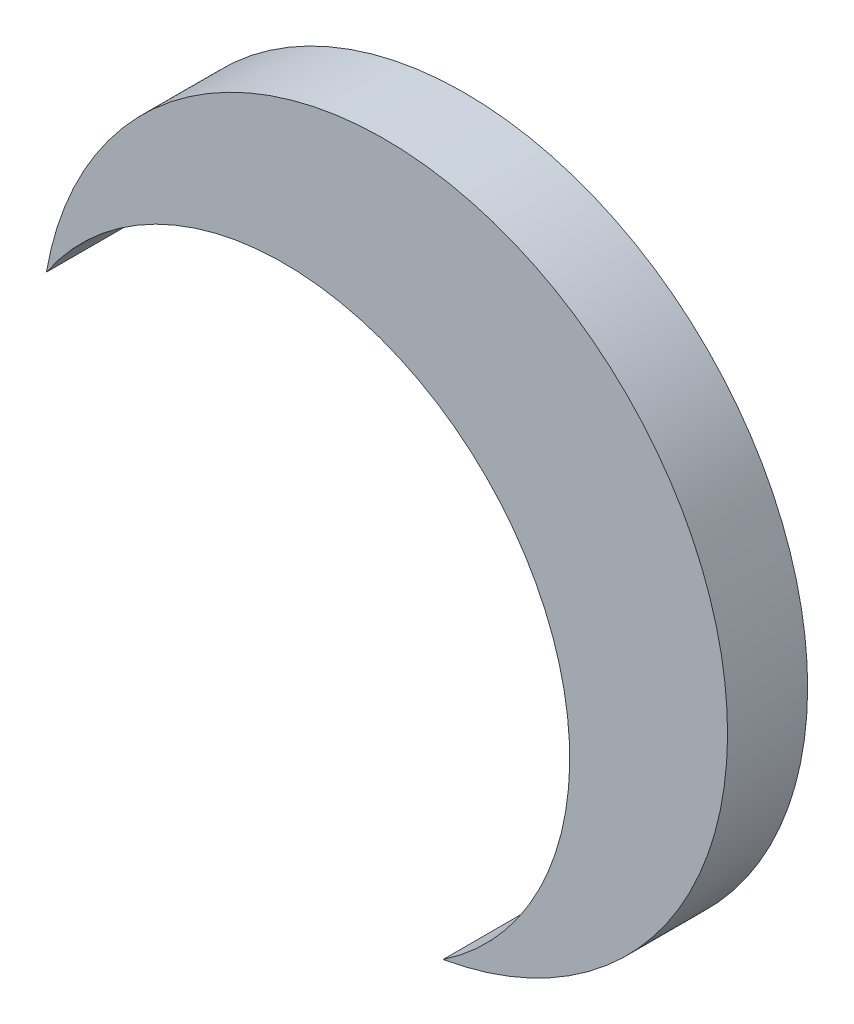
ISO-10303-21;
HEADER;
FILE_DESCRIPTION(('STEP AP214'),'2;1');
FILE_NAME('part.step','',(''),(''),'','','');
FILE_SCHEMA(('AUTOMOTIVE_DESIGN { 1 0 10303 214 1 1 1 1 }'));
ENDSEC;
DATA;
#1=APPLICATION_CONTEXT('core data for automotive mechanical design processes');
#2=APPLICATION_PROTOCOL_DEFINITION('international standard','automotive_design',2000,#1);
#3=PRODUCT_CONTEXT('',#1,'mechanical');
#4=PRODUCT('Part','Part','',(#3));
#5=PRODUCT_RELATED_PRODUCT_CATEGORY('part','',(#4));
#6=PRODUCT_DEFINITION_FORMATION('','',#4);
#7=PRODUCT_DEFINITION_CONTEXT('part definition',#1,'design');
#8=PRODUCT_DEFINITION('design','',#6,#7);
#9=PRODUCT_DEFINITION_SHAPE('','',#8);
#10=(LENGTH_UNIT() NAMED_UNIT(*) SI_UNIT(.MILLI.,.METRE.));
#11=(NAMED_UNIT(*) PLANE_ANGLE_UNIT() SI_UNIT($,.RADIAN.));
#12=(NAMED_UNIT(*) SI_UNIT($,.STERADIAN.) SOLID_ANGLE_UNIT());
#13=UNCERTAINTY_MEASURE_WITH_UNIT(LENGTH_MEASURE(1.E-05),#10,'distance_accuracy_value','');
#14=(GEOMETRIC_REPRESENTATION_CONTEXT(3) GLOBAL_UNCERTAINTY_ASSIGNED_CONTEXT((#13)) GLOBAL_UNIT_ASSIGNED_CONTEXT((#10,
#11,#12)) REPRESENTATION_CONTEXT('',''));
#15=CARTESIAN_POINT('',(0.,0.,0.));
#16=DIRECTION('',(0.,0.,1.));
#17=DIRECTION('',(1.,0.,0.));
#18=AXIS2_PLACEMENT_3D('',#15,#16,#17);
#19=CARTESIAN_POINT('',(132.462,-115.41,1.635));
#20=DIRECTION('',(0.,0.,1.));
#21=DIRECTION('',(1.,0.,0.));
#22=AXIS2_PLACEMENT_3D('',#19,#20,#21);
#23=PLANE('',#22);
#24=CARTESIAN_POINT('',(132.418,-115.304,1.635));
#25=DIRECTION('',(0.,0.,-1.));
#26=DIRECTION('',(0.,-1.,0.));
#27=AXIS2_PLACEMENT_3D('',#24,#25,#26);
#28=CIRCLE('',#27,0.125);
#29=CARTESIAN_POINT('',(132.31421166133,-115.2343366612,1.635));
#30=VERTEX_POINT('',#29);
#31=CARTESIAN_POINT('',(132.48766333873,-115.4077883386,1.635));
#32=VERTEX_POINT('',#31);
#33=EDGE_CURVE('E11',#30,#32,#28,.T.);
#34=ORIENTED_EDGE('',*,*,#33,.T.);
#35=CARTESIAN_POINT('',(132.462,-115.26,1.635));
#36=DIRECTION('',(0.,0.,1.));
#37=DIRECTION('',(0.,-1.,0.));
#38=AXIS2_PLACEMENT_3D('',#35,#36,#37);
#39=CIRCLE('',#38,0.15);
#40=EDGE_CURVE('E56',#32,#30,#39,.T.);
#41=ORIENTED_EDGE('',*,*,#40,.T.);
#42=EDGE_LOOP('',(#34,#41));
#43=FACE_BOUND('',#42,.T.);
#44=ADVANCED_FACE('F17',(#43),#23,.T.);
#45=CARTESIAN_POINT('',(132.418,-115.304,-0.045));
#46=DIRECTION('',(0.,0.,-1.));
#47=DIRECTION('',(0.,-1.,0.));
#48=AXIS2_PLACEMENT_3D('',#45,#46,#47);
#49=CYLINDRICAL_SURFACE('',#48,0.125);
#50=DIRECTION('',(0.,0.,-1.));
#51=VECTOR('',#50,1.);
#52=CARTESIAN_POINT('',(132.48766333867,-115.4077883386,1.6));
#53=LINE('',#52,#51);
#54=CARTESIAN_POINT('',(132.48766333873,-115.4077883386,1.6));
#55=VERTEX_POINT('',#54);
#56=EDGE_CURVE('E54',#32,#55,#53,.T.);
#57=ORIENTED_EDGE('',*,*,#56,.F.);
#58=ORIENTED_EDGE('',*,*,#33,.F.);
#59=DIRECTION('',(0.,0.,-1.));
#60=VECTOR('',#59,1.);
#61=CARTESIAN_POINT('',(132.31421166132,-115.2343366613,1.6));
#62=LINE('',#61,#60);
#63=CARTESIAN_POINT('',(132.31421166133,-115.2343366612,1.6));
#64=VERTEX_POINT('',#63);
#65=EDGE_CURVE('E52',#30,#64,#62,.T.);
#66=ORIENTED_EDGE('',*,*,#65,.T.);
#67=CARTESIAN_POINT('',(132.418,-115.304,1.6));
#68=DIRECTION('',(0.,0.,-1.));
#69=DIRECTION('',(0.,-1.,0.));
#70=AXIS2_PLACEMENT_3D('',#67,#68,#69);
#71=CIRCLE('',#70,0.125);
#72=EDGE_CURVE('E26',#64,#55,#71,.T.);
#73=ORIENTED_EDGE('',*,*,#72,.T.);
#74=EDGE_LOOP('',(#57,#58,#66,#73));
#75=FACE_BOUND('',#74,.T.);
#76=ADVANCED_FACE('F19',(#75),#49,.F.);
#77=CARTESIAN_POINT('',(132.462,-115.41,1.6));
#78=DIRECTION('',(0.,0.,1.));
#79=DIRECTION('',(1.,0.,0.));
#80=AXIS2_PLACEMENT_3D('',#77,#78,#79);
#81=PLANE('',#80);
#82=CARTESIAN_POINT('',(132.462,-115.26,1.6));
#83=DIRECTION('',(0.,0.,1.));
#84=DIRECTION('',(0.,-1.,0.));
#85=AXIS2_PLACEMENT_3D('',#82,#83,#84);
#86=CIRCLE('',#85,0.15);
#87=EDGE_CURVE('E62',#55,#64,#86,.T.);
#88=ORIENTED_EDGE('',*,*,#87,.F.);
#89=ORIENTED_EDGE('',*,*,#72,.F.);
#90=EDGE_LOOP('',(#88,#89));
#91=FACE_BOUND('',#90,.T.);
#92=ADVANCED_FACE('F98',(#91),#81,.F.);
#93=CARTESIAN_POINT('',(132.462,-115.26,1.6));
#94=DIRECTION('',(0.,0.,-1.));
#95=DIRECTION('',(0.,-1.,0.));
#96=AXIS2_PLACEMENT_3D('',#93,#94,#95);
#97=CYLINDRICAL_SURFACE('',#96,0.15);
#98=ORIENTED_EDGE('',*,*,#65,.F.);
#99=ORIENTED_EDGE('',*,*,#40,.F.);
#100=ORIENTED_EDGE('',*,*,#56,.T.);
#101=ORIENTED_EDGE('',*,*,#87,.T.);
#102=EDGE_LOOP('',(#98,#99,#100,#101));
#103=FACE_BOUND('',#102,.T.);
#104=ADVANCED_FACE('F61',(#103),#97,.T.);
#105=CLOSED_SHELL('',(#44,#76,#92,#104));
#106=MANIFOLD_SOLID_BREP('B1',#105);
#107=ADVANCED_BREP_SHAPE_REPRESENTATION('',(#18,#106),#14);
#108=SHAPE_DEFINITION_REPRESENTATION(#9,#107);
ENDSEC;
END-ISO-10303-21;
